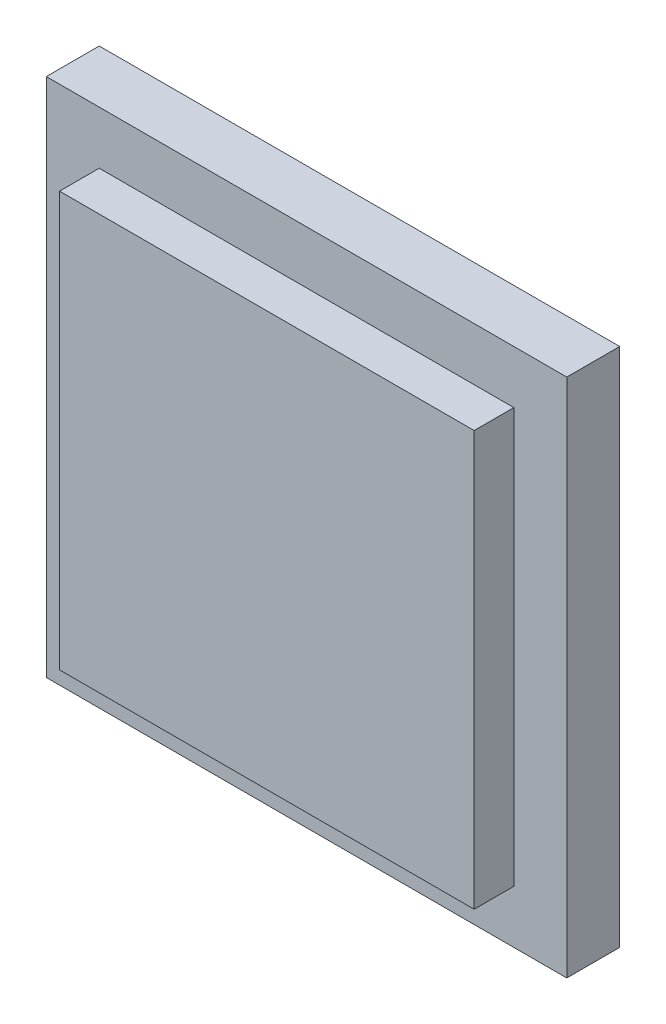
ISO-10303-21;
HEADER;
FILE_DESCRIPTION(('STEP AP214'),'2;1');
FILE_NAME('part.step','',(''),(''),'','','');
FILE_SCHEMA(('AUTOMOTIVE_DESIGN { 1 0 10303 214 1 1 1 1 }'));
ENDSEC;
DATA;
#1=APPLICATION_CONTEXT('core data for automotive mechanical design processes');
#2=APPLICATION_PROTOCOL_DEFINITION('international standard','automotive_design',2000,#1);
#3=PRODUCT_CONTEXT('',#1,'mechanical');
#4=PRODUCT('Part','Part','',(#3));
#5=PRODUCT_RELATED_PRODUCT_CATEGORY('part','',(#4));
#6=PRODUCT_DEFINITION_FORMATION('','',#4);
#7=PRODUCT_DEFINITION_CONTEXT('part definition',#1,'design');
#8=PRODUCT_DEFINITION('design','',#6,#7);
#9=PRODUCT_DEFINITION_SHAPE('','',#8);
#10=(LENGTH_UNIT() NAMED_UNIT(*) SI_UNIT(.MILLI.,.METRE.));
#11=(NAMED_UNIT(*) PLANE_ANGLE_UNIT() SI_UNIT($,.RADIAN.));
#12=(NAMED_UNIT(*) SI_UNIT($,.STERADIAN.) SOLID_ANGLE_UNIT());
#13=UNCERTAINTY_MEASURE_WITH_UNIT(LENGTH_MEASURE(1.E-05),#10,'distance_accuracy_value','');
#14=(GEOMETRIC_REPRESENTATION_CONTEXT(3) GLOBAL_UNCERTAINTY_ASSIGNED_CONTEXT((#13)) GLOBAL_UNIT_ASSIGNED_CONTEXT((#10,
#11,#12)) REPRESENTATION_CONTEXT('',''));
#15=CARTESIAN_POINT('',(0.,0.,0.));
#16=DIRECTION('',(0.,0.,1.));
#17=DIRECTION('',(1.,0.,0.));
#18=AXIS2_PLACEMENT_3D('',#15,#16,#17);
#19=CARTESIAN_POINT('',(0.,0.,6.));
#20=DIRECTION('',(0.,0.,-1.));
#21=DIRECTION('',(-1.,0.,0.));
#22=AXIS2_PLACEMENT_3D('',#19,#20,#21);
#23=PLANE('',#22);
#24=DIRECTION('',(0.,-1.,0.));
#25=VECTOR('',#24,1.);
#26=CARTESIAN_POINT('',(-29.5,-29.5,6.));
#27=LINE('',#26,#25);
#28=CARTESIAN_POINT('',(-29.5,29.5,6.));
#29=VERTEX_POINT('',#28);
#30=CARTESIAN_POINT('',(-29.5,-29.5,6.));
#31=VERTEX_POINT('',#30);
#32=EDGE_CURVE('E129',#29,#31,#27,.T.);
#33=ORIENTED_EDGE('',*,*,#32,.T.);
#34=DIRECTION('',(1.,0.,0.));
#35=VECTOR('',#34,1.);
#36=CARTESIAN_POINT('',(-29.5,-29.5,6.));
#37=LINE('',#36,#35);
#38=CARTESIAN_POINT('',(29.5,-29.5,6.));
#39=VERTEX_POINT('',#38);
#40=EDGE_CURVE('E132',#31,#39,#37,.T.);
#41=ORIENTED_EDGE('',*,*,#40,.T.);
#42=DIRECTION('',(0.,1.,0.));
#43=VECTOR('',#42,1.);
#44=CARTESIAN_POINT('',(29.5,-29.5,6.));
#45=LINE('',#44,#43);
#46=CARTESIAN_POINT('',(29.5,29.5,6.));
#47=VERTEX_POINT('',#46);
#48=EDGE_CURVE('E135',#39,#47,#45,.T.);
#49=ORIENTED_EDGE('',*,*,#48,.T.);
#50=DIRECTION('',(-1.,0.,0.));
#51=VECTOR('',#50,1.);
#52=CARTESIAN_POINT('',(-29.5,29.5,6.));
#53=LINE('',#52,#51);
#54=EDGE_CURVE('E137',#47,#29,#53,.T.);
#55=ORIENTED_EDGE('',*,*,#54,.T.);
#56=EDGE_LOOP('',(#33,#41,#49,#55));
#57=FACE_BOUND('',#56,.T.);
#58=DIRECTION('',(0.,-1.,0.));
#59=VECTOR('',#58,1.);
#60=CARTESIAN_POINT('',(-23.5,-23.5,6.));
#61=LINE('',#60,#59);
#62=CARTESIAN_POINT('',(-23.5,23.5,6.));
#63=VERTEX_POINT('',#62);
#64=CARTESIAN_POINT('',(-23.5,-23.5,6.));
#65=VERTEX_POINT('',#64);
#66=EDGE_CURVE('E50',#63,#65,#61,.T.);
#67=ORIENTED_EDGE('',*,*,#66,.F.);
#68=DIRECTION('',(-1.,0.,0.));
#69=VECTOR('',#68,1.);
#70=CARTESIAN_POINT('',(-23.5,23.5,6.));
#71=LINE('',#70,#69);
#72=CARTESIAN_POINT('',(23.5,23.5,6.));
#73=VERTEX_POINT('',#72);
#74=EDGE_CURVE('E54',#73,#63,#71,.T.);
#75=ORIENTED_EDGE('',*,*,#74,.F.);
#76=DIRECTION('',(0.,1.,0.));
#77=VECTOR('',#76,1.);
#78=CARTESIAN_POINT('',(23.5,-23.5,6.));
#79=LINE('',#78,#77);
#80=CARTESIAN_POINT('',(23.5,-23.5,6.));
#81=VERTEX_POINT('',#80);
#82=EDGE_CURVE('E262',#81,#73,#79,.T.);
#83=ORIENTED_EDGE('',*,*,#82,.F.);
#84=DIRECTION('',(1.,0.,0.));
#85=VECTOR('',#84,1.);
#86=CARTESIAN_POINT('',(-23.5,-23.5,6.));
#87=LINE('',#86,#85);
#88=EDGE_CURVE('E268',#65,#81,#87,.T.);
#89=ORIENTED_EDGE('',*,*,#88,.F.);
#90=EDGE_LOOP('',(#67,#75,#83,#89));
#91=FACE_BOUND('',#90,.T.);
#92=ADVANCED_FACE('F35',(#57,#91),#23,.F.);
#93=CARTESIAN_POINT('',(-29.5,-29.5,6.));
#94=DIRECTION('',(1.,0.,0.));
#95=DIRECTION('',(0.,1.,0.));
#96=AXIS2_PLACEMENT_3D('',#93,#94,#95);
#97=PLANE('',#96);
#98=DIRECTION('',(0.,-1.,0.));
#99=VECTOR('',#98,1.);
#100=CARTESIAN_POINT('',(-29.5,-29.5,0.));
#101=LINE('',#100,#99);
#102=CARTESIAN_POINT('',(-29.5,29.5,0.));
#103=VERTEX_POINT('',#102);
#104=CARTESIAN_POINT('',(-29.5,-29.5,0.));
#105=VERTEX_POINT('',#104);
#106=EDGE_CURVE('E120',#103,#105,#101,.T.);
#107=ORIENTED_EDGE('',*,*,#106,.T.);
#108=DIRECTION('',(0.,0.,-1.));
#109=VECTOR('',#108,1.);
#110=CARTESIAN_POINT('',(-29.5,-29.5,6.));
#111=LINE('',#110,#109);
#112=EDGE_CURVE('E11',#31,#105,#111,.T.);
#113=ORIENTED_EDGE('',*,*,#112,.F.);
#114=ORIENTED_EDGE('',*,*,#32,.F.);
#115=DIRECTION('',(0.,0.,-1.));
#116=VECTOR('',#115,1.);
#117=CARTESIAN_POINT('',(-29.5,29.5,6.));
#118=LINE('',#117,#116);
#119=EDGE_CURVE('E138',#29,#103,#118,.T.);
#120=ORIENTED_EDGE('',*,*,#119,.T.);
#121=EDGE_LOOP('',(#107,#113,#114,#120));
#122=FACE_BOUND('',#121,.T.);
#123=ADVANCED_FACE('F37',(#122),#97,.F.);
#124=CARTESIAN_POINT('',(-29.5,-29.5,6.));
#125=DIRECTION('',(0.,1.,0.));
#126=DIRECTION('',(0.,0.,1.));
#127=AXIS2_PLACEMENT_3D('',#124,#125,#126);
#128=PLANE('',#127);
#129=DIRECTION('',(1.,0.,0.));
#130=VECTOR('',#129,1.);
#131=CARTESIAN_POINT('',(-29.5,-29.5,0.));
#132=LINE('',#131,#130);
#133=CARTESIAN_POINT('',(29.5,-29.5,0.));
#134=VERTEX_POINT('',#133);
#135=EDGE_CURVE('E123',#105,#134,#132,.T.);
#136=ORIENTED_EDGE('',*,*,#135,.T.);
#137=DIRECTION('',(0.,0.,-1.));
#138=VECTOR('',#137,1.);
#139=CARTESIAN_POINT('',(29.5,-29.5,6.));
#140=LINE('',#139,#138);
#141=EDGE_CURVE('E43',#39,#134,#140,.T.);
#142=ORIENTED_EDGE('',*,*,#141,.F.);
#143=ORIENTED_EDGE('',*,*,#40,.F.);
#144=ORIENTED_EDGE('',*,*,#112,.T.);
#145=EDGE_LOOP('',(#136,#142,#143,#144));
#146=FACE_BOUND('',#145,.T.);
#147=ADVANCED_FACE('F168',(#146),#128,.F.);
#148=CARTESIAN_POINT('',(29.5,-29.5,6.));
#149=DIRECTION('',(-1.,0.,0.));
#150=DIRECTION('',(0.,-1.,0.));
#151=AXIS2_PLACEMENT_3D('',#148,#149,#150);
#152=PLANE('',#151);
#153=DIRECTION('',(0.,1.,0.));
#154=VECTOR('',#153,1.);
#155=CARTESIAN_POINT('',(29.5,-29.5,0.));
#156=LINE('',#155,#154);
#157=CARTESIAN_POINT('',(29.5,29.5,0.));
#158=VERTEX_POINT('',#157);
#159=EDGE_CURVE('E141',#134,#158,#156,.T.);
#160=ORIENTED_EDGE('',*,*,#159,.T.);
#161=DIRECTION('',(0.,0.,-1.));
#162=VECTOR('',#161,1.);
#163=CARTESIAN_POINT('',(29.5,29.5,6.));
#164=LINE('',#163,#162);
#165=EDGE_CURVE('E146',#47,#158,#164,.T.);
#166=ORIENTED_EDGE('',*,*,#165,.F.);
#167=ORIENTED_EDGE('',*,*,#48,.F.);
#168=ORIENTED_EDGE('',*,*,#141,.T.);
#169=EDGE_LOOP('',(#160,#166,#167,#168));
#170=FACE_BOUND('',#169,.T.);
#171=ADVANCED_FACE('F153',(#170),#152,.F.);
#172=CARTESIAN_POINT('',(-29.5,29.5,6.));
#173=DIRECTION('',(0.,-1.,0.));
#174=DIRECTION('',(0.,0.,-1.));
#175=AXIS2_PLACEMENT_3D('',#172,#173,#174);
#176=PLANE('',#175);
#177=DIRECTION('',(-1.,0.,0.));
#178=VECTOR('',#177,1.);
#179=CARTESIAN_POINT('',(-29.5,29.5,0.));
#180=LINE('',#179,#178);
#181=EDGE_CURVE('E133',#158,#103,#180,.T.);
#182=ORIENTED_EDGE('',*,*,#181,.T.);
#183=ORIENTED_EDGE('',*,*,#119,.F.);
#184=ORIENTED_EDGE('',*,*,#54,.F.);
#185=ORIENTED_EDGE('',*,*,#165,.T.);
#186=EDGE_LOOP('',(#182,#183,#184,#185));
#187=FACE_BOUND('',#186,.T.);
#188=ADVANCED_FACE('F162',(#187),#176,.F.);
#189=CARTESIAN_POINT('',(0.,0.,0.));
#190=DIRECTION('',(0.,0.,-1.));
#191=DIRECTION('',(-1.,0.,0.));
#192=AXIS2_PLACEMENT_3D('',#189,#190,#191);
#193=PLANE('',#192);
#194=ORIENTED_EDGE('',*,*,#106,.F.);
#195=ORIENTED_EDGE('',*,*,#181,.F.);
#196=ORIENTED_EDGE('',*,*,#159,.F.);
#197=ORIENTED_EDGE('',*,*,#135,.F.);
#198=EDGE_LOOP('',(#194,#195,#196,#197));
#199=FACE_BOUND('',#198,.T.);
#200=ADVANCED_FACE('F159',(#199),#193,.T.);
#201=CARTESIAN_POINT('',(-23.5,-23.5,10.5));
#202=DIRECTION('',(1.,0.,0.));
#203=DIRECTION('',(0.,1.,0.));
#204=AXIS2_PLACEMENT_3D('',#201,#202,#203);
#205=PLANE('',#204);
#206=ORIENTED_EDGE('',*,*,#66,.T.);
#207=DIRECTION('',(0.,0.,-1.));
#208=VECTOR('',#207,1.);
#209=CARTESIAN_POINT('',(-23.5,-23.5,10.5));
#210=LINE('',#209,#208);
#211=CARTESIAN_POINT('',(-23.5,-23.5,10.5));
#212=VERTEX_POINT('',#211);
#213=EDGE_CURVE('E103',#212,#65,#210,.T.);
#214=ORIENTED_EDGE('',*,*,#213,.F.);
#215=DIRECTION('',(0.,-1.,0.));
#216=VECTOR('',#215,1.);
#217=CARTESIAN_POINT('',(-23.5,-23.5,10.5));
#218=LINE('',#217,#216);
#219=CARTESIAN_POINT('',(-23.5,23.5,10.5));
#220=VERTEX_POINT('',#219);
#221=EDGE_CURVE('E109',#220,#212,#218,.T.);
#222=ORIENTED_EDGE('',*,*,#221,.F.);
#223=DIRECTION('',(0.,0.,-1.));
#224=VECTOR('',#223,1.);
#225=CARTESIAN_POINT('',(-23.5,23.5,10.5));
#226=LINE('',#225,#224);
#227=EDGE_CURVE('E260',#220,#63,#226,.T.);
#228=ORIENTED_EDGE('',*,*,#227,.T.);
#229=EDGE_LOOP('',(#206,#214,#222,#228));
#230=FACE_BOUND('',#229,.T.);
#231=ADVANCED_FACE('F119',(#230),#205,.F.);
#232=CARTESIAN_POINT('',(-23.5,-23.5,10.5));
#233=DIRECTION('',(0.,1.,0.));
#234=DIRECTION('',(0.,0.,1.));
#235=AXIS2_PLACEMENT_3D('',#232,#233,#234);
#236=PLANE('',#235);
#237=ORIENTED_EDGE('',*,*,#88,.T.);
#238=DIRECTION('',(0.,0.,-1.));
#239=VECTOR('',#238,1.);
#240=CARTESIAN_POINT('',(23.5,-23.5,10.5));
#241=LINE('',#240,#239);
#242=CARTESIAN_POINT('',(23.5,-23.5,10.5));
#243=VERTEX_POINT('',#242);
#244=EDGE_CURVE('E105',#243,#81,#241,.T.);
#245=ORIENTED_EDGE('',*,*,#244,.F.);
#246=DIRECTION('',(1.,0.,0.));
#247=VECTOR('',#246,1.);
#248=CARTESIAN_POINT('',(-23.5,-23.5,10.5));
#249=LINE('',#248,#247);
#250=EDGE_CURVE('E98',#212,#243,#249,.T.);
#251=ORIENTED_EDGE('',*,*,#250,.F.);
#252=ORIENTED_EDGE('',*,*,#213,.T.);
#253=EDGE_LOOP('',(#237,#245,#251,#252));
#254=FACE_BOUND('',#253,.T.);
#255=ADVANCED_FACE('F101',(#254),#236,.F.);
#256=CARTESIAN_POINT('',(23.5,-23.5,10.5));
#257=DIRECTION('',(-1.,0.,0.));
#258=DIRECTION('',(0.,-1.,0.));
#259=AXIS2_PLACEMENT_3D('',#256,#257,#258);
#260=PLANE('',#259);
#261=ORIENTED_EDGE('',*,*,#82,.T.);
#262=DIRECTION('',(0.,0.,-1.));
#263=VECTOR('',#262,1.);
#264=CARTESIAN_POINT('',(23.5,23.5,10.5));
#265=LINE('',#264,#263);
#266=CARTESIAN_POINT('',(23.5,23.5,10.5));
#267=VERTEX_POINT('',#266);
#268=EDGE_CURVE('E125',#267,#73,#265,.T.);
#269=ORIENTED_EDGE('',*,*,#268,.F.);
#270=DIRECTION('',(0.,1.,0.));
#271=VECTOR('',#270,1.);
#272=CARTESIAN_POINT('',(23.5,-23.5,10.5));
#273=LINE('',#272,#271);
#274=EDGE_CURVE('E108',#243,#267,#273,.T.);
#275=ORIENTED_EDGE('',*,*,#274,.F.);
#276=ORIENTED_EDGE('',*,*,#244,.T.);
#277=EDGE_LOOP('',(#261,#269,#275,#276));
#278=FACE_BOUND('',#277,.T.);
#279=ADVANCED_FACE('F204',(#278),#260,.F.);
#280=CARTESIAN_POINT('',(-23.5,23.5,10.5));
#281=DIRECTION('',(0.,-1.,0.));
#282=DIRECTION('',(0.,0.,-1.));
#283=AXIS2_PLACEMENT_3D('',#280,#281,#282);
#284=PLANE('',#283);
#285=ORIENTED_EDGE('',*,*,#74,.T.);
#286=ORIENTED_EDGE('',*,*,#227,.F.);
#287=DIRECTION('',(-1.,0.,0.));
#288=VECTOR('',#287,1.);
#289=CARTESIAN_POINT('',(-23.5,23.5,10.5));
#290=LINE('',#289,#288);
#291=EDGE_CURVE('E114',#267,#220,#290,.T.);
#292=ORIENTED_EDGE('',*,*,#291,.F.);
#293=ORIENTED_EDGE('',*,*,#268,.T.);
#294=EDGE_LOOP('',(#285,#286,#292,#293));
#295=FACE_BOUND('',#294,.T.);
#296=ADVANCED_FACE('F210',(#295),#284,.F.);
#297=CARTESIAN_POINT('',(0.,0.,10.5));
#298=DIRECTION('',(0.,0.,-1.));
#299=DIRECTION('',(-1.,0.,0.));
#300=AXIS2_PLACEMENT_3D('',#297,#298,#299);
#301=PLANE('',#300);
#302=ORIENTED_EDGE('',*,*,#221,.T.);
#303=ORIENTED_EDGE('',*,*,#250,.T.);
#304=ORIENTED_EDGE('',*,*,#274,.T.);
#305=ORIENTED_EDGE('',*,*,#291,.T.);
#306=EDGE_LOOP('',(#302,#303,#304,#305));
#307=FACE_BOUND('',#306,.T.);
#308=ADVANCED_FACE('F112',(#307),#301,.F.);
#309=CLOSED_SHELL('',(#92,#123,#147,#171,#188,#200,#231,#255,#279,#296,#308));
#310=MANIFOLD_SOLID_BREP('B2',#309);
#311=ADVANCED_BREP_SHAPE_REPRESENTATION('',(#18,#310),#14);
#312=SHAPE_DEFINITION_REPRESENTATION(#9,#311);
ENDSEC;
END-ISO-10303-21;
